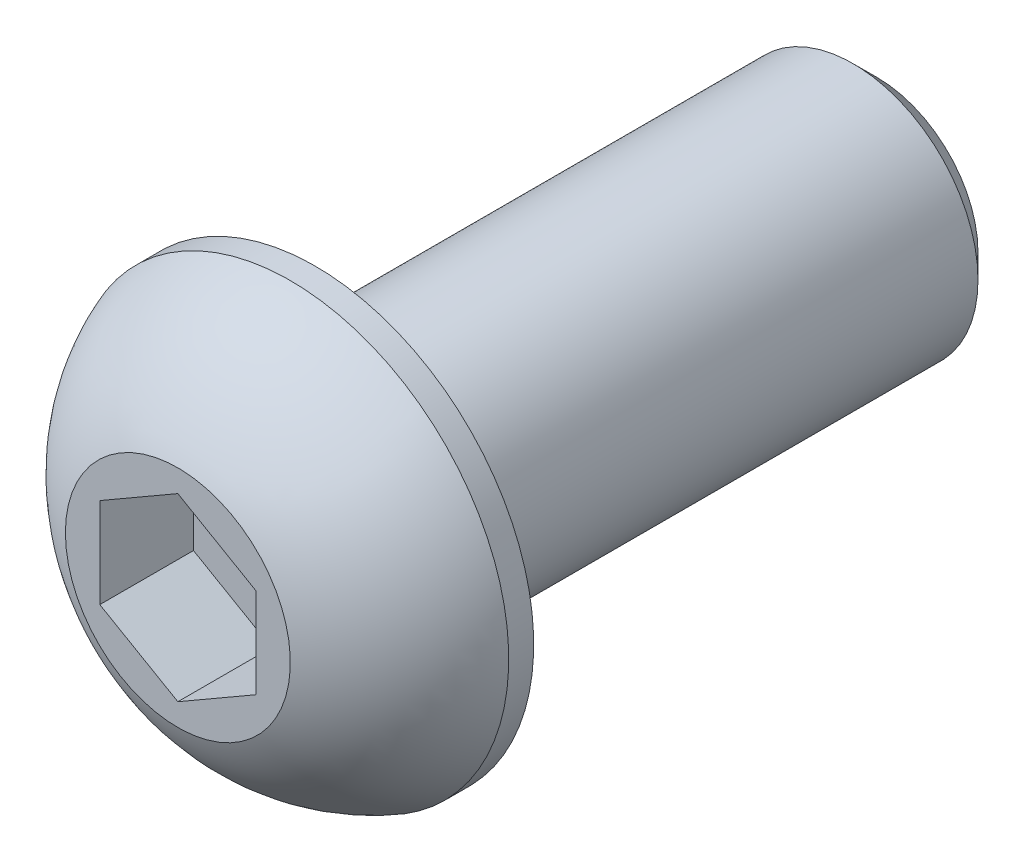
ISO-10303-21;
HEADER;
FILE_DESCRIPTION(('STEP AP214'),'2;1');
FILE_NAME('part.step','',(''),(''),'','','');
FILE_SCHEMA(('AUTOMOTIVE_DESIGN { 1 0 10303 214 1 1 1 1 }'));
ENDSEC;
DATA;
#1=APPLICATION_CONTEXT('core data for automotive mechanical design processes');
#2=APPLICATION_PROTOCOL_DEFINITION('international standard','automotive_design',2000,#1);
#3=PRODUCT_CONTEXT('',#1,'mechanical');
#4=PRODUCT('Part','Part','',(#3));
#5=PRODUCT_RELATED_PRODUCT_CATEGORY('part','',(#4));
#6=PRODUCT_DEFINITION_FORMATION('','',#4);
#7=PRODUCT_DEFINITION_CONTEXT('part definition',#1,'design');
#8=PRODUCT_DEFINITION('design','',#6,#7);
#9=PRODUCT_DEFINITION_SHAPE('','',#8);
#10=(LENGTH_UNIT() NAMED_UNIT(*) SI_UNIT(.MILLI.,.METRE.));
#11=(NAMED_UNIT(*) PLANE_ANGLE_UNIT() SI_UNIT($,.RADIAN.));
#12=(NAMED_UNIT(*) SI_UNIT($,.STERADIAN.) SOLID_ANGLE_UNIT());
#13=UNCERTAINTY_MEASURE_WITH_UNIT(LENGTH_MEASURE(1.E-05),#10,'distance_accuracy_value','');
#14=(GEOMETRIC_REPRESENTATION_CONTEXT(3) GLOBAL_UNCERTAINTY_ASSIGNED_CONTEXT((#13)) GLOBAL_UNIT_ASSIGNED_CONTEXT((#10,
#11,#12)) REPRESENTATION_CONTEXT('',''));
#15=CARTESIAN_POINT('',(0.,0.,0.));
#16=DIRECTION('',(0.,0.,1.));
#17=DIRECTION('',(1.,0.,0.));
#18=AXIS2_PLACEMENT_3D('',#15,#16,#17);
#19=CARTESIAN_POINT('',(0.,0.,-1.33666273520731));
#20=DIRECTION('',(0.,0.,-1.));
#21=DIRECTION('',(-1.,0.,0.));
#22=AXIS2_PLACEMENT_3D('',#19,#20,#21);
#23=DEGENERATE_TOROIDAL_SURFACE('',#22,1.12956738202778,6.24718390686361,.T.);
#24=CARTESIAN_POINT('',(0.,0.,4.4));
#25=DIRECTION('',(0.,0.,-1.));
#26=DIRECTION('',(-1.,0.,0.));
#27=AXIS2_PLACEMENT_3D('',#24,#25,#26);
#28=CIRCLE('',#27,3.603028);
#29=CARTESIAN_POINT('',(-3.603028,0.,4.4));
#30=VERTEX_POINT('',#29);
#31=EDGE_CURVE('E147',#30,#30,#28,.T.);
#32=ORIENTED_EDGE('',*,*,#31,.T.);
#33=EDGE_LOOP('',(#32));
#34=FACE_BOUND('',#33,.T.);
#35=CARTESIAN_POINT('',(0.,0.,0.799999999999998));
#36=DIRECTION('',(0.,0.,-1.));
#37=DIRECTION('',(-1.,0.,0.));
#38=AXIS2_PLACEMENT_3D('',#35,#36,#37);
#39=CIRCLE('',#38,7.);
#40=CARTESIAN_POINT('',(-7.,0.,0.799999999999998));
#41=VERTEX_POINT('',#40);
#42=EDGE_CURVE('E136',#41,#41,#39,.T.);
#43=ORIENTED_EDGE('',*,*,#42,.F.);
#44=EDGE_LOOP('',(#43));
#45=FACE_BOUND('',#44,.T.);
#46=ADVANCED_FACE('F34',(#34,#45),#23,.T.);
#47=CARTESIAN_POINT('',(3.603028,0.,4.4));
#48=DIRECTION('',(0.,0.,1.));
#49=DIRECTION('',(1.,0.,0.));
#50=AXIS2_PLACEMENT_3D('',#47,#48,#49);
#51=PLANE('',#50);
#52=DIRECTION('',(0.866025403784439,0.5,0.));
#53=VECTOR('',#52,1.);
#54=CARTESIAN_POINT('',(0.,-2.88675134594813,4.4));
#55=LINE('',#54,#53);
#56=CARTESIAN_POINT('',(0.,-2.88675134594813,4.4));
#57=VERTEX_POINT('',#56);
#58=CARTESIAN_POINT('',(2.5,-1.44337567297406,4.4));
#59=VERTEX_POINT('',#58);
#60=EDGE_CURVE('E49',#57,#59,#55,.T.);
#61=ORIENTED_EDGE('',*,*,#60,.F.);
#62=DIRECTION('',(0.866025403784439,-0.5,0.));
#63=VECTOR('',#62,1.);
#64=CARTESIAN_POINT('',(-2.5,-1.44337567297406,4.4));
#65=LINE('',#64,#63);
#66=CARTESIAN_POINT('',(-2.5,-1.44337567297406,4.4));
#67=VERTEX_POINT('',#66);
#68=EDGE_CURVE('E132',#67,#57,#65,.T.);
#69=ORIENTED_EDGE('',*,*,#68,.F.);
#70=DIRECTION('',(0.,-1.,0.));
#71=VECTOR('',#70,1.);
#72=CARTESIAN_POINT('',(-2.5,1.44337567297406,4.4));
#73=LINE('',#72,#71);
#74=CARTESIAN_POINT('',(-2.5,1.44337567297406,4.4));
#75=VERTEX_POINT('',#74);
#76=EDGE_CURVE('E130',#75,#67,#73,.T.);
#77=ORIENTED_EDGE('',*,*,#76,.F.);
#78=DIRECTION('',(-0.866025403784439,-0.5,0.));
#79=VECTOR('',#78,1.);
#80=CARTESIAN_POINT('',(0.,2.88675134594813,4.4));
#81=LINE('',#80,#79);
#82=CARTESIAN_POINT('',(0.,2.88675134594813,4.4));
#83=VERTEX_POINT('',#82);
#84=EDGE_CURVE('E97',#83,#75,#81,.T.);
#85=ORIENTED_EDGE('',*,*,#84,.F.);
#86=DIRECTION('',(-0.866025403784439,0.5,0.));
#87=VECTOR('',#86,1.);
#88=CARTESIAN_POINT('',(2.5,1.44337567297406,4.4));
#89=LINE('',#88,#87);
#90=CARTESIAN_POINT('',(2.5,1.44337567297406,4.4));
#91=VERTEX_POINT('',#90);
#92=EDGE_CURVE('E126',#91,#83,#89,.T.);
#93=ORIENTED_EDGE('',*,*,#92,.F.);
#94=DIRECTION('',(0.,1.,0.));
#95=VECTOR('',#94,1.);
#96=CARTESIAN_POINT('',(2.5,-1.44337567297406,4.4));
#97=LINE('',#96,#95);
#98=EDGE_CURVE('E123',#59,#91,#97,.T.);
#99=ORIENTED_EDGE('',*,*,#98,.F.);
#100=EDGE_LOOP('',(#61,#69,#77,#85,#93,#99));
#101=FACE_BOUND('',#100,.T.);
#102=ORIENTED_EDGE('',*,*,#31,.F.);
#103=EDGE_LOOP('',(#102));
#104=FACE_BOUND('',#103,.T.);
#105=ADVANCED_FACE('F170',(#101,#104),#51,.T.);
#106=CARTESIAN_POINT('',(0.,0.,0.));
#107=DIRECTION('',(0.,0.,-1.));
#108=DIRECTION('',(-1.,0.,0.));
#109=AXIS2_PLACEMENT_3D('',#106,#107,#108);
#110=PLANE('',#109);
#111=CARTESIAN_POINT('',(0.,0.,0.));
#112=DIRECTION('',(0.,0.,-1.));
#113=DIRECTION('',(-1.,0.,0.));
#114=AXIS2_PLACEMENT_3D('',#111,#112,#113);
#115=CIRCLE('',#114,4.4);
#116=CARTESIAN_POINT('',(-4.4,0.,0.));
#117=VERTEX_POINT('',#116);
#118=EDGE_CURVE('E11',#117,#117,#115,.F.);
#119=ORIENTED_EDGE('',*,*,#118,.T.);
#120=EDGE_LOOP('',(#119));
#121=FACE_BOUND('',#120,.T.);
#122=CARTESIAN_POINT('',(0.,0.,0.));
#123=DIRECTION('',(0.,0.,-1.));
#124=DIRECTION('',(-1.,0.,0.));
#125=AXIS2_PLACEMENT_3D('',#122,#123,#124);
#126=CIRCLE('',#125,7.);
#127=CARTESIAN_POINT('',(-7.,0.,0.));
#128=VERTEX_POINT('',#127);
#129=EDGE_CURVE('E144',#128,#128,#126,.T.);
#130=ORIENTED_EDGE('',*,*,#129,.T.);
#131=EDGE_LOOP('',(#130));
#132=FACE_BOUND('',#131,.T.);
#133=ADVANCED_FACE('F176',(#121,#132),#110,.T.);
#134=CARTESIAN_POINT('',(0.,0.,4.4));
#135=DIRECTION('',(0.,0.,-1.));
#136=DIRECTION('',(-1.,0.,0.));
#137=AXIS2_PLACEMENT_3D('',#134,#135,#136);
#138=CYLINDRICAL_SURFACE('',#137,7.);
#139=ORIENTED_EDGE('',*,*,#42,.T.);
#140=EDGE_LOOP('',(#139));
#141=FACE_BOUND('',#140,.T.);
#142=ORIENTED_EDGE('',*,*,#129,.F.);
#143=EDGE_LOOP('',(#142));
#144=FACE_BOUND('',#143,.T.);
#145=ADVANCED_FACE('F183',(#141,#144),#138,.T.);
#146=CARTESIAN_POINT('',(0.,0.,-18.));
#147=DIRECTION('',(0.,0.,1.));
#148=DIRECTION('',(1.,0.,0.));
#149=AXIS2_PLACEMENT_3D('',#146,#147,#148);
#150=CYLINDRICAL_SURFACE('',#149,4.);
#151=CARTESIAN_POINT('',(0.,0.,-0.399999999999994));
#152=DIRECTION('',(0.,0.,-1.));
#153=DIRECTION('',(-1.,0.,0.));
#154=AXIS2_PLACEMENT_3D('',#151,#152,#153);
#155=CIRCLE('',#154,4.);
#156=CARTESIAN_POINT('',(-4.,0.,-0.399999999999994));
#157=VERTEX_POINT('',#156);
#158=EDGE_CURVE('E42',#157,#157,#155,.T.);
#159=ORIENTED_EDGE('',*,*,#158,.T.);
#160=EDGE_LOOP('',(#159));
#161=FACE_BOUND('',#160,.T.);
#162=CARTESIAN_POINT('',(0.,0.,-17.2331999999057));
#163=DIRECTION('',(0.,0.,-1.));
#164=DIRECTION('',(-1.,0.,0.));
#165=AXIS2_PLACEMENT_3D('',#162,#163,#164);
#166=CIRCLE('',#165,4.);
#167=CARTESIAN_POINT('',(-4.,0.,-17.2331999999057));
#168=VERTEX_POINT('',#167);
#169=EDGE_CURVE('E153',#168,#168,#166,.F.);
#170=ORIENTED_EDGE('',*,*,#169,.T.);
#171=EDGE_LOOP('',(#170));
#172=FACE_BOUND('',#171,.T.);
#173=ADVANCED_FACE('F158',(#161,#172),#150,.T.);
#174=CARTESIAN_POINT('',(0.,0.,-18.));
#175=DIRECTION('',(0.,0.,-1.));
#176=DIRECTION('',(-1.,0.,0.));
#177=AXIS2_PLACEMENT_3D('',#174,#175,#176);
#178=PLANE('',#177);
#179=CARTESIAN_POINT('',(0.,0.,-18.));
#180=DIRECTION('',(0.,0.,-1.));
#181=DIRECTION('',(-1.,0.,0.));
#182=AXIS2_PLACEMENT_3D('',#179,#180,#181);
#183=CIRCLE('',#182,3.23319999996255);
#184=CARTESIAN_POINT('',(-3.23319999996255,0.,-18.));
#185=VERTEX_POINT('',#184);
#186=EDGE_CURVE('E150',#185,#185,#183,.T.);
#187=ORIENTED_EDGE('',*,*,#186,.T.);
#188=EDGE_LOOP('',(#187));
#189=FACE_BOUND('',#188,.T.);
#190=ADVANCED_FACE('F190',(#189),#178,.T.);
#191=CARTESIAN_POINT('',(0.,-2.88675134594813,1.4));
#192=DIRECTION('',(0.5,-0.866025403784438,0.));
#193=DIRECTION('',(0.866025403784439,0.5,0.));
#194=AXIS2_PLACEMENT_3D('',#191,#192,#193);
#195=PLANE('',#194);
#196=ORIENTED_EDGE('',*,*,#60,.T.);
#197=DIRECTION('',(0.,0.,1.));
#198=VECTOR('',#197,1.);
#199=CARTESIAN_POINT('',(2.5,-1.44337567297406,1.4));
#200=LINE('',#199,#198);
#201=CARTESIAN_POINT('',(2.5,-1.44337567297406,1.4));
#202=VERTEX_POINT('',#201);
#203=EDGE_CURVE('E79',#202,#59,#200,.T.);
#204=ORIENTED_EDGE('',*,*,#203,.F.);
#205=DIRECTION('',(0.866025403784439,0.5,0.));
#206=VECTOR('',#205,1.);
#207=CARTESIAN_POINT('',(0.,-2.88675134594813,1.4));
#208=LINE('',#207,#206);
#209=CARTESIAN_POINT('',(0.,-2.88675134594813,1.4));
#210=VERTEX_POINT('',#209);
#211=EDGE_CURVE('E134',#210,#202,#208,.T.);
#212=ORIENTED_EDGE('',*,*,#211,.F.);
#213=DIRECTION('',(0.,0.,1.));
#214=VECTOR('',#213,1.);
#215=CARTESIAN_POINT('',(0.,-2.88675134594813,1.4));
#216=LINE('',#215,#214);
#217=EDGE_CURVE('E57',#210,#57,#216,.T.);
#218=ORIENTED_EDGE('',*,*,#217,.T.);
#219=EDGE_LOOP('',(#196,#204,#212,#218));
#220=FACE_BOUND('',#219,.T.);
#221=ADVANCED_FACE('F193',(#220),#195,.F.);
#222=CARTESIAN_POINT('',(-2.5,-1.44337567297406,1.4));
#223=DIRECTION('',(-0.5,-0.866025403784439,0.));
#224=DIRECTION('',(0.866025403784439,-0.5,0.));
#225=AXIS2_PLACEMENT_3D('',#222,#223,#224);
#226=PLANE('',#225);
#227=ORIENTED_EDGE('',*,*,#68,.T.);
#228=ORIENTED_EDGE('',*,*,#217,.F.);
#229=DIRECTION('',(0.866025403784439,-0.5,0.));
#230=VECTOR('',#229,1.);
#231=CARTESIAN_POINT('',(-2.5,-1.44337567297406,1.4));
#232=LINE('',#231,#230);
#233=CARTESIAN_POINT('',(-2.5,-1.44337567297406,1.4));
#234=VERTEX_POINT('',#233);
#235=EDGE_CURVE('E109',#234,#210,#232,.T.);
#236=ORIENTED_EDGE('',*,*,#235,.F.);
#237=DIRECTION('',(0.,0.,1.));
#238=VECTOR('',#237,1.);
#239=CARTESIAN_POINT('',(-2.5,-1.44337567297406,1.4));
#240=LINE('',#239,#238);
#241=EDGE_CURVE('E101',#234,#67,#240,.T.);
#242=ORIENTED_EDGE('',*,*,#241,.T.);
#243=EDGE_LOOP('',(#227,#228,#236,#242));
#244=FACE_BOUND('',#243,.T.);
#245=ADVANCED_FACE('F197',(#244),#226,.F.);
#246=CARTESIAN_POINT('',(-2.5,1.44337567297406,1.4));
#247=DIRECTION('',(-1.,0.,0.));
#248=DIRECTION('',(0.,-1.,0.));
#249=AXIS2_PLACEMENT_3D('',#246,#247,#248);
#250=PLANE('',#249);
#251=ORIENTED_EDGE('',*,*,#76,.T.);
#252=ORIENTED_EDGE('',*,*,#241,.F.);
#253=DIRECTION('',(0.,-1.,0.));
#254=VECTOR('',#253,1.);
#255=CARTESIAN_POINT('',(-2.5,1.44337567297406,1.4));
#256=LINE('',#255,#254);
#257=CARTESIAN_POINT('',(-2.5,1.44337567297406,1.4));
#258=VERTEX_POINT('',#257);
#259=EDGE_CURVE('E105',#258,#234,#256,.T.);
#260=ORIENTED_EDGE('',*,*,#259,.F.);
#261=DIRECTION('',(0.,0.,1.));
#262=VECTOR('',#261,1.);
#263=CARTESIAN_POINT('',(-2.5,1.44337567297406,1.4));
#264=LINE('',#263,#262);
#265=EDGE_CURVE('E90',#258,#75,#264,.T.);
#266=ORIENTED_EDGE('',*,*,#265,.T.);
#267=EDGE_LOOP('',(#251,#252,#260,#266));
#268=FACE_BOUND('',#267,.T.);
#269=ADVANCED_FACE('F106',(#268),#250,.F.);
#270=CARTESIAN_POINT('',(0.,2.88675134594813,1.4));
#271=DIRECTION('',(-0.5,0.866025403784439,0.));
#272=DIRECTION('',(-0.866025403784439,-0.5,0.));
#273=AXIS2_PLACEMENT_3D('',#270,#271,#272);
#274=PLANE('',#273);
#275=ORIENTED_EDGE('',*,*,#84,.T.);
#276=ORIENTED_EDGE('',*,*,#265,.F.);
#277=DIRECTION('',(-0.866025403784439,-0.5,0.));
#278=VECTOR('',#277,1.);
#279=CARTESIAN_POINT('',(0.,2.88675134594813,1.4));
#280=LINE('',#279,#278);
#281=CARTESIAN_POINT('',(0.,2.88675134594813,1.4));
#282=VERTEX_POINT('',#281);
#283=EDGE_CURVE('E94',#282,#258,#280,.T.);
#284=ORIENTED_EDGE('',*,*,#283,.F.);
#285=DIRECTION('',(0.,0.,1.));
#286=VECTOR('',#285,1.);
#287=CARTESIAN_POINT('',(0.,2.88675134594813,1.4));
#288=LINE('',#287,#286);
#289=EDGE_CURVE('E102',#282,#83,#288,.T.);
#290=ORIENTED_EDGE('',*,*,#289,.T.);
#291=EDGE_LOOP('',(#275,#276,#284,#290));
#292=FACE_BOUND('',#291,.T.);
#293=ADVANCED_FACE('F92',(#292),#274,.F.);
#294=CARTESIAN_POINT('',(2.5,1.44337567297406,1.4));
#295=DIRECTION('',(0.5,0.866025403784439,0.));
#296=DIRECTION('',(-0.866025403784439,0.5,0.));
#297=AXIS2_PLACEMENT_3D('',#294,#295,#296);
#298=PLANE('',#297);
#299=ORIENTED_EDGE('',*,*,#92,.T.);
#300=ORIENTED_EDGE('',*,*,#289,.F.);
#301=DIRECTION('',(-0.866025403784439,0.5,0.));
#302=VECTOR('',#301,1.);
#303=CARTESIAN_POINT('',(2.5,1.44337567297406,1.4));
#304=LINE('',#303,#302);
#305=CARTESIAN_POINT('',(2.5,1.44337567297406,1.4));
#306=VERTEX_POINT('',#305);
#307=EDGE_CURVE('E115',#306,#282,#304,.T.);
#308=ORIENTED_EDGE('',*,*,#307,.F.);
#309=DIRECTION('',(0.,0.,1.));
#310=VECTOR('',#309,1.);
#311=CARTESIAN_POINT('',(2.5,1.44337567297406,1.4));
#312=LINE('',#311,#310);
#313=EDGE_CURVE('E139',#306,#91,#312,.T.);
#314=ORIENTED_EDGE('',*,*,#313,.T.);
#315=EDGE_LOOP('',(#299,#300,#308,#314));
#316=FACE_BOUND('',#315,.T.);
#317=ADVANCED_FACE('F201',(#316),#298,.F.);
#318=CARTESIAN_POINT('',(2.5,-1.44337567297406,1.4));
#319=DIRECTION('',(1.,0.,0.));
#320=DIRECTION('',(0.,1.,0.));
#321=AXIS2_PLACEMENT_3D('',#318,#319,#320);
#322=PLANE('',#321);
#323=ORIENTED_EDGE('',*,*,#98,.T.);
#324=ORIENTED_EDGE('',*,*,#313,.F.);
#325=DIRECTION('',(0.,1.,0.));
#326=VECTOR('',#325,1.);
#327=CARTESIAN_POINT('',(2.5,-1.44337567297406,1.4));
#328=LINE('',#327,#326);
#329=EDGE_CURVE('E117',#202,#306,#328,.T.);
#330=ORIENTED_EDGE('',*,*,#329,.F.);
#331=ORIENTED_EDGE('',*,*,#203,.T.);
#332=EDGE_LOOP('',(#323,#324,#330,#331));
#333=FACE_BOUND('',#332,.T.);
#334=ADVANCED_FACE('F198',(#333),#322,.F.);
#335=CARTESIAN_POINT('',(0.,0.,1.4));
#336=DIRECTION('',(0.,0.,1.));
#337=DIRECTION('',(1.,0.,0.));
#338=AXIS2_PLACEMENT_3D('',#335,#336,#337);
#339=PLANE('',#338);
#340=ORIENTED_EDGE('',*,*,#211,.T.);
#341=ORIENTED_EDGE('',*,*,#329,.T.);
#342=ORIENTED_EDGE('',*,*,#307,.T.);
#343=ORIENTED_EDGE('',*,*,#283,.T.);
#344=ORIENTED_EDGE('',*,*,#259,.T.);
#345=ORIENTED_EDGE('',*,*,#235,.T.);
#346=EDGE_LOOP('',(#340,#341,#342,#343,#344,#345));
#347=FACE_BOUND('',#346,.T.);
#348=ADVANCED_FACE('F112',(#347),#339,.T.);
#349=CARTESIAN_POINT('',(0.,0.,-18.));
#350=DIRECTION('',(0.,0.,1.));
#351=DIRECTION('',(1.,0.,0.));
#352=AXIS2_PLACEMENT_3D('',#349,#350,#351);
#353=CONICAL_SURFACE('',#352,3.23319999996255,0.785398163360378);
#354=ORIENTED_EDGE('',*,*,#169,.F.);
#355=EDGE_LOOP('',(#354));
#356=FACE_BOUND('',#355,.T.);
#357=ORIENTED_EDGE('',*,*,#186,.F.);
#358=EDGE_LOOP('',(#357));
#359=FACE_BOUND('',#358,.T.);
#360=ADVANCED_FACE('F162',(#356,#359),#353,.T.);
#361=CARTESIAN_POINT('',(0.,0.,-0.399999999999994));
#362=DIRECTION('',(0.,0.,-1.));
#363=DIRECTION('',(-1.,0.,0.));
#364=AXIS2_PLACEMENT_3D('',#361,#362,#363);
#365=TOROIDAL_SURFACE('',#364,4.4,0.4);
#366=ORIENTED_EDGE('',*,*,#118,.F.);
#367=EDGE_LOOP('',(#366));
#368=FACE_BOUND('',#367,.T.);
#369=ORIENTED_EDGE('',*,*,#158,.F.);
#370=EDGE_LOOP('',(#369));
#371=FACE_BOUND('',#370,.T.);
#372=ADVANCED_FACE('F36',(#368,#371),#365,.F.);
#373=CLOSED_SHELL('',(#46,#105,#133,#145,#173,#190,#221,#245,#269,#293,#317,#334,#348,#360,#372));
#374=MANIFOLD_SOLID_BREP('B2',#373);
#375=ADVANCED_BREP_SHAPE_REPRESENTATION('',(#18,#374),#14);
#376=SHAPE_DEFINITION_REPRESENTATION(#9,#375);
ENDSEC;
END-ISO-10303-21;
